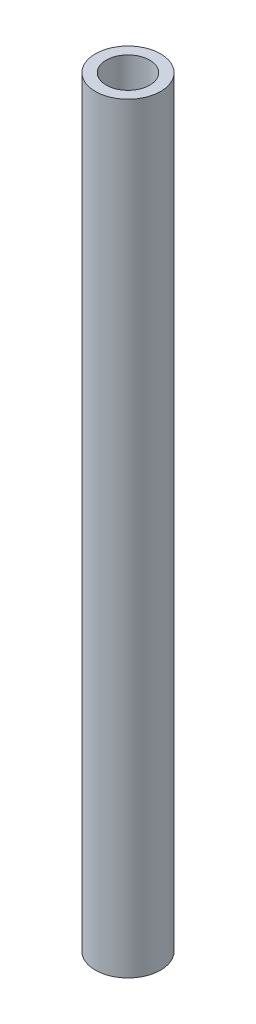
ISO-10303-21;
HEADER;
FILE_DESCRIPTION(('STEP AP214'),'2;1');
FILE_NAME('part.step','',(''),(''),'','','');
FILE_SCHEMA(('AUTOMOTIVE_DESIGN { 1 0 10303 214 1 1 1 1 }'));
ENDSEC;
DATA;
#1=APPLICATION_CONTEXT('core data for automotive mechanical design processes');
#2=APPLICATION_PROTOCOL_DEFINITION('international standard','automotive_design',2000,#1);
#3=PRODUCT_CONTEXT('',#1,'mechanical');
#4=PRODUCT('Part','Part','',(#3));
#5=PRODUCT_RELATED_PRODUCT_CATEGORY('part','',(#4));
#6=PRODUCT_DEFINITION_FORMATION('','',#4);
#7=PRODUCT_DEFINITION_CONTEXT('part definition',#1,'design');
#8=PRODUCT_DEFINITION('design','',#6,#7);
#9=PRODUCT_DEFINITION_SHAPE('','',#8);
#10=(LENGTH_UNIT() NAMED_UNIT(*) SI_UNIT(.MILLI.,.METRE.));
#11=(NAMED_UNIT(*) PLANE_ANGLE_UNIT() SI_UNIT($,.RADIAN.));
#12=(NAMED_UNIT(*) SI_UNIT($,.STERADIAN.) SOLID_ANGLE_UNIT());
#13=UNCERTAINTY_MEASURE_WITH_UNIT(LENGTH_MEASURE(1.E-05),#10,'distance_accuracy_value','');
#14=(GEOMETRIC_REPRESENTATION_CONTEXT(3) GLOBAL_UNCERTAINTY_ASSIGNED_CONTEXT((#13)) GLOBAL_UNIT_ASSIGNED_CONTEXT((#10,
#11,#12)) REPRESENTATION_CONTEXT('',''));
#15=CARTESIAN_POINT('',(0.,0.,0.));
#16=DIRECTION('',(0.,0.,1.));
#17=DIRECTION('',(1.,0.,0.));
#18=AXIS2_PLACEMENT_3D('',#15,#16,#17);
#19=CARTESIAN_POINT('',(0.,70.,0.));
#20=DIRECTION('',(0.,1.,0.));
#21=DIRECTION('',(0.,0.,1.));
#22=AXIS2_PLACEMENT_3D('',#19,#20,#21);
#23=PLANE('',#22);
#24=CARTESIAN_POINT('',(0.,70.,0.));
#25=DIRECTION('',(0.,1.,0.));
#26=DIRECTION('',(0.,0.,1.));
#27=AXIS2_PLACEMENT_3D('',#24,#25,#26);
#28=CIRCLE('',#27,3.);
#29=CARTESIAN_POINT('',(0.,70.,3.));
#30=VERTEX_POINT('',#29);
#31=EDGE_CURVE('E10',#30,#30,#28,.T.);
#32=ORIENTED_EDGE('',*,*,#31,.T.);
#33=EDGE_LOOP('',(#32));
#34=FACE_BOUND('',#33,.T.);
#35=CARTESIAN_POINT('',(0.,70.,0.));
#36=DIRECTION('',(0.,1.,0.));
#37=DIRECTION('',(0.,0.,1.));
#38=AXIS2_PLACEMENT_3D('',#35,#36,#37);
#39=CIRCLE('',#38,2.);
#40=CARTESIAN_POINT('',(0.,70.,2.));
#41=VERTEX_POINT('',#40);
#42=EDGE_CURVE('E43',#41,#41,#39,.T.);
#43=ORIENTED_EDGE('',*,*,#42,.F.);
#44=EDGE_LOOP('',(#43));
#45=FACE_BOUND('',#44,.T.);
#46=ADVANCED_FACE('F32',(#34,#45),#23,.T.);
#47=CARTESIAN_POINT('',(0.,0.,0.));
#48=DIRECTION('',(0.,1.,0.));
#49=DIRECTION('',(0.,0.,1.));
#50=AXIS2_PLACEMENT_3D('',#47,#48,#49);
#51=PLANE('',#50);
#52=CARTESIAN_POINT('',(0.,0.,0.));
#53=DIRECTION('',(0.,1.,0.));
#54=DIRECTION('',(0.,0.,1.));
#55=AXIS2_PLACEMENT_3D('',#52,#53,#54);
#56=CIRCLE('',#55,3.);
#57=CARTESIAN_POINT('',(0.,0.,3.));
#58=VERTEX_POINT('',#57);
#59=EDGE_CURVE('E36',#58,#58,#56,.T.);
#60=ORIENTED_EDGE('',*,*,#59,.F.);
#61=EDGE_LOOP('',(#60));
#62=FACE_BOUND('',#61,.T.);
#63=CARTESIAN_POINT('',(0.,0.,0.));
#64=DIRECTION('',(0.,1.,0.));
#65=DIRECTION('',(0.,0.,1.));
#66=AXIS2_PLACEMENT_3D('',#63,#64,#65);
#67=CIRCLE('',#66,2.);
#68=CARTESIAN_POINT('',(0.,0.,2.));
#69=VERTEX_POINT('',#68);
#70=EDGE_CURVE('E45',#69,#69,#67,.T.);
#71=ORIENTED_EDGE('',*,*,#70,.T.);
#72=EDGE_LOOP('',(#71));
#73=FACE_BOUND('',#72,.T.);
#74=ADVANCED_FACE('F55',(#62,#73),#51,.F.);
#75=CARTESIAN_POINT('',(0.,70.,0.));
#76=DIRECTION('',(0.,-1.,0.));
#77=DIRECTION('',(0.,0.,-1.));
#78=AXIS2_PLACEMENT_3D('',#75,#76,#77);
#79=CYLINDRICAL_SURFACE('',#78,3.);
#80=ORIENTED_EDGE('',*,*,#31,.F.);
#81=EDGE_LOOP('',(#80));
#82=FACE_BOUND('',#81,.T.);
#83=ORIENTED_EDGE('',*,*,#59,.T.);
#84=EDGE_LOOP('',(#83));
#85=FACE_BOUND('',#84,.T.);
#86=ADVANCED_FACE('F34',(#82,#85),#79,.T.);
#87=CARTESIAN_POINT('',(0.,70.,0.));
#88=DIRECTION('',(0.,-1.,0.));
#89=DIRECTION('',(0.,0.,-1.));
#90=AXIS2_PLACEMENT_3D('',#87,#88,#89);
#91=CYLINDRICAL_SURFACE('',#90,2.);
#92=ORIENTED_EDGE('',*,*,#42,.T.);
#93=EDGE_LOOP('',(#92));
#94=FACE_BOUND('',#93,.T.);
#95=ORIENTED_EDGE('',*,*,#70,.F.);
#96=EDGE_LOOP('',(#95));
#97=FACE_BOUND('',#96,.T.);
#98=ADVANCED_FACE('F51',(#94,#97),#91,.F.);
#99=CLOSED_SHELL('',(#46,#74,#86,#98));
#100=MANIFOLD_SOLID_BREP('B2',#99);
#101=ADVANCED_BREP_SHAPE_REPRESENTATION('',(#18,#100),#14);
#102=SHAPE_DEFINITION_REPRESENTATION(#9,#101);
ENDSEC;
END-ISO-10303-21;
